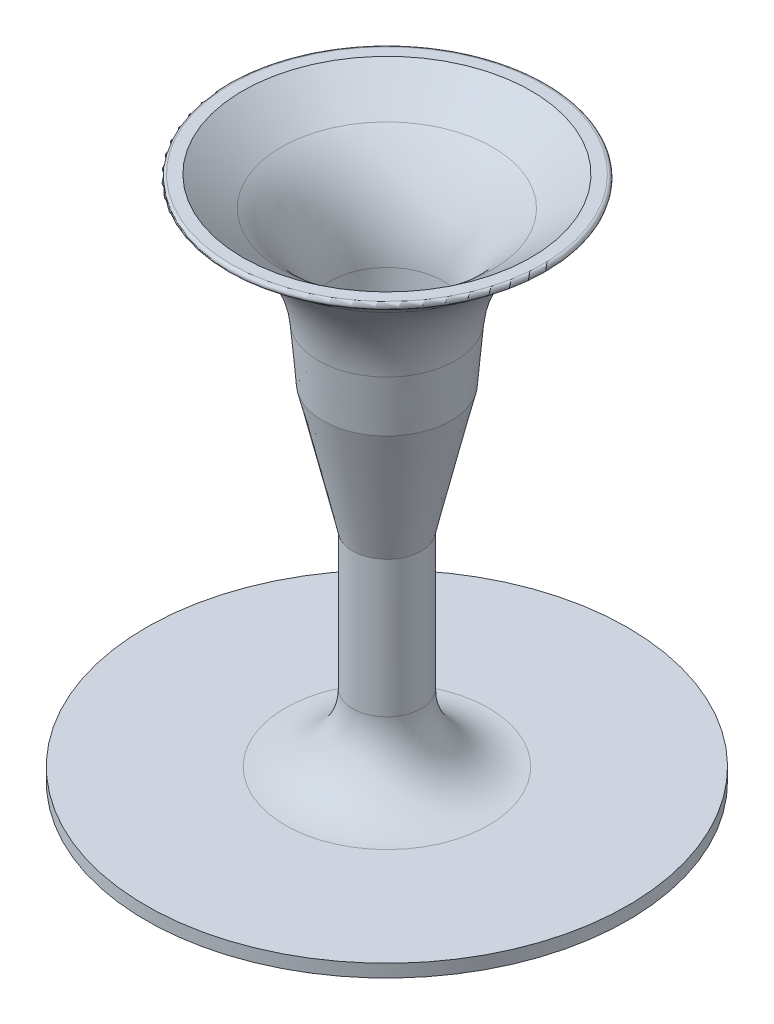
ISO-10303-21;
HEADER;
FILE_DESCRIPTION(('STEP AP214'),'2;1');
FILE_NAME('part.step','',(''),(''),'','','');
FILE_SCHEMA(('AUTOMOTIVE_DESIGN { 1 0 10303 214 1 1 1 1 }'));
ENDSEC;
DATA;
#1=APPLICATION_CONTEXT('core data for automotive mechanical design processes');
#2=APPLICATION_PROTOCOL_DEFINITION('international standard','automotive_design',2000,#1);
#3=PRODUCT_CONTEXT('',#1,'mechanical');
#4=PRODUCT('Part','Part','',(#3));
#5=PRODUCT_RELATED_PRODUCT_CATEGORY('part','',(#4));
#6=PRODUCT_DEFINITION_FORMATION('','',#4);
#7=PRODUCT_DEFINITION_CONTEXT('part definition',#1,'design');
#8=PRODUCT_DEFINITION('design','',#6,#7);
#9=PRODUCT_DEFINITION_SHAPE('','',#8);
#10=(LENGTH_UNIT() NAMED_UNIT(*) SI_UNIT(.MILLI.,.METRE.));
#11=(NAMED_UNIT(*) PLANE_ANGLE_UNIT() SI_UNIT($,.RADIAN.));
#12=(NAMED_UNIT(*) SI_UNIT($,.STERADIAN.) SOLID_ANGLE_UNIT());
#13=UNCERTAINTY_MEASURE_WITH_UNIT(LENGTH_MEASURE(1.E-05),#10,'distance_accuracy_value','');
#14=(GEOMETRIC_REPRESENTATION_CONTEXT(3) GLOBAL_UNCERTAINTY_ASSIGNED_CONTEXT((#13)) GLOBAL_UNIT_ASSIGNED_CONTEXT((#10,
#11,#12)) REPRESENTATION_CONTEXT('',''));
#15=CARTESIAN_POINT('',(0.,0.,0.));
#16=DIRECTION('',(0.,0.,1.));
#17=DIRECTION('',(1.,0.,0.));
#18=AXIS2_PLACEMENT_3D('',#15,#16,#17);
#19=CARTESIAN_POINT('',(0.,-50.,0.));
#20=DIRECTION('',(0.,1.,0.));
#21=DIRECTION('',(0.,0.,1.));
#22=AXIS2_PLACEMENT_3D('',#19,#20,#21);
#23=PLANE('',#22);
#24=CARTESIAN_POINT('',(0.,-50.,0.));
#25=DIRECTION('',(0.,1.,0.));
#26=DIRECTION('',(0.,0.,1.));
#27=AXIS2_PLACEMENT_3D('',#24,#25,#26);
#28=CIRCLE('',#27,3.34999999999998);
#29=CARTESIAN_POINT('',(0.,-50.,3.34999999999998));
#30=VERTEX_POINT('',#29);
#31=EDGE_CURVE('E57',#30,#30,#28,.T.);
#32=ORIENTED_EDGE('',*,*,#31,.T.);
#33=EDGE_LOOP('',(#32));
#34=FACE_BOUND('',#33,.T.);
#35=ADVANCED_FACE('F37',(#34),#23,.T.);
#36=CARTESIAN_POINT('',(0.,74.3904688799529,0.));
#37=DIRECTION('',(0.,1.,0.));
#38=DIRECTION('',(0.,0.,1.));
#39=AXIS2_PLACEMENT_3D('',#36,#37,#38);
#40=CYLINDRICAL_SURFACE('',#39,3.34999999999998);
#41=CARTESIAN_POINT('',(0.,-20.,0.));
#42=DIRECTION('',(0.,1.,0.));
#43=DIRECTION('',(0.,0.,1.));
#44=AXIS2_PLACEMENT_3D('',#41,#42,#43);
#45=CIRCLE('',#44,3.34999999999998);
#46=CARTESIAN_POINT('',(0.,-20.,3.34999999999998));
#47=VERTEX_POINT('',#46);
#48=EDGE_CURVE('E60',#47,#47,#45,.T.);
#49=ORIENTED_EDGE('',*,*,#48,.T.);
#50=EDGE_LOOP('',(#49));
#51=FACE_BOUND('',#50,.T.);
#52=ORIENTED_EDGE('',*,*,#31,.F.);
#53=EDGE_LOOP('',(#52));
#54=FACE_BOUND('',#53,.T.);
#55=ADVANCED_FACE('F113',(#51,#54),#40,.F.);
#56=CARTESIAN_POINT('',(0.,-20.,0.));
#57=DIRECTION('',(0.,1.,0.));
#58=DIRECTION('',(0.,0.,1.));
#59=AXIS2_PLACEMENT_3D('',#56,#57,#58);
#60=CONICAL_SURFACE('',#59,3.34999999999998,0.228441482093904);
#61=CARTESIAN_POINT('',(0.,0.,0.));
#62=DIRECTION('',(0.,1.,0.));
#63=DIRECTION('',(0.,0.,1.));
#64=AXIS2_PLACEMENT_3D('',#61,#62,#63);
#65=CIRCLE('',#64,8.);
#66=CARTESIAN_POINT('',(0.,0.,8.));
#67=VERTEX_POINT('',#66);
#68=EDGE_CURVE('E63',#67,#67,#65,.T.);
#69=ORIENTED_EDGE('',*,*,#68,.T.);
#70=EDGE_LOOP('',(#69));
#71=FACE_BOUND('',#70,.T.);
#72=ORIENTED_EDGE('',*,*,#48,.F.);
#73=EDGE_LOOP('',(#72));
#74=FACE_BOUND('',#73,.T.);
#75=ADVANCED_FACE('F119',(#71,#74),#60,.F.);
#76=CARTESIAN_POINT('',(0.,0.,0.));
#77=DIRECTION('',(0.,1.,0.));
#78=DIRECTION('',(0.,0.,1.));
#79=AXIS2_PLACEMENT_3D('',#76,#77,#78);
#80=CONICAL_SURFACE('',#79,8.,0.0831412318884402);
#81=CARTESIAN_POINT('',(0.,9.19533592387511,0.));
#82=DIRECTION('',(0.,1.,0.));
#83=DIRECTION('',(0.,0.,1.));
#84=AXIS2_PLACEMENT_3D('',#81,#82,#83);
#85=CIRCLE('',#84,8.76627799365625);
#86=CARTESIAN_POINT('',(0.,9.19533592387511,8.76627799365625));
#87=VERTEX_POINT('',#86);
#88=EDGE_CURVE('E66',#87,#87,#85,.T.);
#89=ORIENTED_EDGE('',*,*,#88,.T.);
#90=EDGE_LOOP('',(#89));
#91=FACE_BOUND('',#90,.T.);
#92=ORIENTED_EDGE('',*,*,#68,.F.);
#93=EDGE_LOOP('',(#92));
#94=FACE_BOUND('',#93,.T.);
#95=ADVANCED_FACE('F151',(#91,#94),#80,.F.);
#96=CARTESIAN_POINT('',(0.,7.53442632680031,0.));
#97=DIRECTION('',(0.,1.,0.));
#98=DIRECTION('',(0.,0.,1.));
#99=AXIS2_PLACEMENT_3D('',#96,#97,#98);
#100=TOROIDAL_SURFACE('',#99,28.6971931585538,20.);
#101=CARTESIAN_POINT('',(0.,23.3869061088923,0.));
#102=DIRECTION('',(0.,1.,0.));
#103=DIRECTION('',(0.,0.,1.));
#104=AXIS2_PLACEMENT_3D('',#101,#102,#103);
#105=CIRCLE('',#104,16.50297794156);
#106=CARTESIAN_POINT('',(0.,23.3869061088923,16.50297794156));
#107=VERTEX_POINT('',#106);
#108=EDGE_CURVE('E69',#107,#107,#105,.T.);
#109=ORIENTED_EDGE('',*,*,#108,.T.);
#110=EDGE_LOOP('',(#109));
#111=FACE_BOUND('',#110,.T.);
#112=ORIENTED_EDGE('',*,*,#88,.F.);
#113=EDGE_LOOP('',(#112));
#114=FACE_BOUND('',#113,.T.);
#115=ADVANCED_FACE('F145',(#111,#114),#100,.T.);
#116=CARTESIAN_POINT('',(0.,23.3869061088923,0.));
#117=DIRECTION('',(0.,1.,0.));
#118=DIRECTION('',(0.,0.,1.));
#119=AXIS2_PLACEMENT_3D('',#116,#117,#118);
#120=CONICAL_SURFACE('',#119,16.50297794156,0.915100700553362);
#121=CARTESIAN_POINT('',(0.,28.,0.));
#122=DIRECTION('',(0.,1.,0.));
#123=DIRECTION('',(0.,0.,1.));
#124=AXIS2_PLACEMENT_3D('',#121,#122,#123);
#125=CIRCLE('',#124,22.5);
#126=CARTESIAN_POINT('',(0.,28.,22.5));
#127=VERTEX_POINT('',#126);
#128=EDGE_CURVE('E72',#127,#127,#125,.T.);
#129=ORIENTED_EDGE('',*,*,#128,.T.);
#130=EDGE_LOOP('',(#129));
#131=FACE_BOUND('',#130,.T.);
#132=ORIENTED_EDGE('',*,*,#108,.F.);
#133=EDGE_LOOP('',(#132));
#134=FACE_BOUND('',#133,.T.);
#135=ADVANCED_FACE('F139',(#131,#134),#120,.F.);
#136=CARTESIAN_POINT('',(-25.7802438933713,28.,0.));
#137=DIRECTION('',(0.,1.,0.));
#138=DIRECTION('',(0.,0.,1.));
#139=AXIS2_PLACEMENT_3D('',#136,#137,#138);
#140=PLANE('',#139);
#141=CARTESIAN_POINT('',(0.,28.,0.));
#142=DIRECTION('',(0.,1.,0.));
#143=DIRECTION('',(0.,0.,1.));
#144=AXIS2_PLACEMENT_3D('',#141,#142,#143);
#145=CIRCLE('',#144,24.3101829200285);
#146=CARTESIAN_POINT('',(0.,28.,24.3101829200285));
#147=VERTEX_POINT('',#146);
#148=EDGE_CURVE('E52',#147,#147,#145,.T.);
#149=ORIENTED_EDGE('',*,*,#148,.T.);
#150=EDGE_LOOP('',(#149));
#151=FACE_BOUND('',#150,.T.);
#152=ORIENTED_EDGE('',*,*,#128,.F.);
#153=EDGE_LOOP('',(#152));
#154=FACE_BOUND('',#153,.T.);
#155=ADVANCED_FACE('F135',(#151,#154),#140,.T.);
#156=CARTESIAN_POINT('',(0.,26.4147520217908,0.));
#157=DIRECTION('',(0.,1.,0.));
#158=DIRECTION('',(0.,0.,1.));
#159=AXIS2_PLACEMENT_3D('',#156,#157,#158);
#160=CONICAL_SURFACE('',#159,23.7194215216994,0.915100700553361);
#161=CARTESIAN_POINT('',(0.,27.1036880054477,0.));
#162=DIRECTION('',(0.,-1.,0.));
#163=DIRECTION('',(0.,0.,-1.));
#164=AXIS2_PLACEMENT_3D('',#161,#162,#163);
#165=CIRCLE('',#164,24.6150383004533);
#166=CARTESIAN_POINT('',(0.,27.1036880054477,-24.6150383004533));
#167=VERTEX_POINT('',#166);
#168=EDGE_CURVE('E48',#167,#167,#165,.T.);
#169=ORIENTED_EDGE('',*,*,#168,.T.);
#170=EDGE_LOOP('',(#169));
#171=FACE_BOUND('',#170,.T.);
#172=CARTESIAN_POINT('',(0.,22.3403487415723,0.));
#173=DIRECTION('',(0.,1.,0.));
#174=DIRECTION('',(0.,0.,1.));
#175=AXIS2_PLACEMENT_3D('',#172,#173,#174);
#176=CIRCLE('',#175,18.4226972574154);
#177=CARTESIAN_POINT('',(0.,22.3403487415723,18.4226972574154));
#178=VERTEX_POINT('',#177);
#179=EDGE_CURVE('E75',#178,#178,#176,.T.);
#180=ORIENTED_EDGE('',*,*,#179,.T.);
#181=EDGE_LOOP('',(#180));
#182=FACE_BOUND('',#181,.T.);
#183=ADVANCED_FACE('F138',(#171,#182),#160,.T.);
#184=CARTESIAN_POINT('',(0.,6.48786895948034,0.));
#185=DIRECTION('',(0.,1.,0.));
#186=DIRECTION('',(0.,0.,1.));
#187=AXIS2_PLACEMENT_3D('',#184,#185,#186);
#188=TOROIDAL_SURFACE('',#187,30.6169124744092,20.);
#189=CARTESIAN_POINT('',(0.,8.14877855655515,0.));
#190=DIRECTION('',(0.,1.,0.));
#191=DIRECTION('',(0.,0.,1.));
#192=AXIS2_PLACEMENT_3D('',#189,#190,#191);
#193=CIRCLE('',#192,10.6859973095116);
#194=CARTESIAN_POINT('',(0.,8.14877855655515,10.6859973095116));
#195=VERTEX_POINT('',#194);
#196=EDGE_CURVE('E78',#195,#195,#193,.T.);
#197=ORIENTED_EDGE('',*,*,#196,.T.);
#198=EDGE_LOOP('',(#197));
#199=FACE_BOUND('',#198,.T.);
#200=ORIENTED_EDGE('',*,*,#179,.F.);
#201=EDGE_LOOP('',(#200));
#202=FACE_BOUND('',#201,.T.);
#203=ADVANCED_FACE('F170',(#199,#202),#188,.F.);
#204=CARTESIAN_POINT('',(0.,8.14877855655515,0.));
#205=DIRECTION('',(0.,1.,0.));
#206=DIRECTION('',(0.,0.,1.));
#207=AXIS2_PLACEMENT_3D('',#204,#205,#206);
#208=CONICAL_SURFACE('',#207,10.6859973095116,0.083141231888441);
#209=CARTESIAN_POINT('',(0.,-0.311144597230181,0.));
#210=DIRECTION('',(0.,1.,0.));
#211=DIRECTION('',(0.,0.,1.));
#212=AXIS2_PLACEMENT_3D('',#209,#210,#211);
#213=CIRCLE('',#212,9.98100371336286);
#214=CARTESIAN_POINT('',(0.,-0.311144597230181,9.98100371336286));
#215=VERTEX_POINT('',#214);
#216=EDGE_CURVE('E81',#215,#215,#213,.T.);
#217=ORIENTED_EDGE('',*,*,#216,.T.);
#218=EDGE_LOOP('',(#217));
#219=FACE_BOUND('',#218,.T.);
#220=ORIENTED_EDGE('',*,*,#196,.F.);
#221=EDGE_LOOP('',(#220));
#222=FACE_BOUND('',#221,.T.);
#223=ADVANCED_FACE('F174',(#219,#222),#208,.T.);
#224=CARTESIAN_POINT('',(0.,-0.311144597230181,0.));
#225=DIRECTION('',(0.,1.,0.));
#226=DIRECTION('',(0.,0.,1.));
#227=AXIS2_PLACEMENT_3D('',#224,#225,#226);
#228=CONICAL_SURFACE('',#227,9.98100371336286,0.228441482093904);
#229=CARTESIAN_POINT('',(0.,-20.2294401385758,0.));
#230=DIRECTION('',(0.,1.,0.));
#231=DIRECTION('',(0.,0.,1.));
#232=AXIS2_PLACEMENT_3D('',#229,#230,#231);
#233=CIRCLE('',#232,5.34999999999999);
#234=CARTESIAN_POINT('',(0.,-20.2294401385758,5.34999999999999));
#235=VERTEX_POINT('',#234);
#236=EDGE_CURVE('E84',#235,#235,#233,.T.);
#237=ORIENTED_EDGE('',*,*,#236,.T.);
#238=EDGE_LOOP('',(#237));
#239=FACE_BOUND('',#238,.T.);
#240=ORIENTED_EDGE('',*,*,#216,.F.);
#241=EDGE_LOOP('',(#240));
#242=FACE_BOUND('',#241,.T.);
#243=ADVANCED_FACE('F129',(#239,#242),#228,.T.);
#244=CARTESIAN_POINT('',(0.,74.3904688799529,0.));
#245=DIRECTION('',(0.,1.,0.));
#246=DIRECTION('',(0.,0.,1.));
#247=AXIS2_PLACEMENT_3D('',#244,#245,#246);
#248=CYLINDRICAL_SURFACE('',#247,5.34999999999999);
#249=CARTESIAN_POINT('',(0.,-41.5,0.));
#250=DIRECTION('',(0.,-1.,0.));
#251=DIRECTION('',(0.,0.,-1.));
#252=AXIS2_PLACEMENT_3D('',#249,#250,#251);
#253=CIRCLE('',#252,5.34999999999999);
#254=CARTESIAN_POINT('',(0.,-41.5,-5.34999999999999));
#255=VERTEX_POINT('',#254);
#256=EDGE_CURVE('E44',#255,#255,#253,.F.);
#257=ORIENTED_EDGE('',*,*,#256,.T.);
#258=EDGE_LOOP('',(#257));
#259=FACE_BOUND('',#258,.T.);
#260=ORIENTED_EDGE('',*,*,#236,.F.);
#261=EDGE_LOOP('',(#260));
#262=FACE_BOUND('',#261,.T.);
#263=ADVANCED_FACE('F124',(#259,#262),#248,.T.);
#264=CARTESIAN_POINT('',(0.,27.5,0.));
#265=DIRECTION('',(0.,1.,0.));
#266=DIRECTION('',(0.,0.,1.));
#267=AXIS2_PLACEMENT_3D('',#264,#265,#266);
#268=TOROIDAL_SURFACE('',#267,24.3101829200285,0.5);
#269=ORIENTED_EDGE('',*,*,#168,.F.);
#270=EDGE_LOOP('',(#269));
#271=FACE_BOUND('',#270,.T.);
#272=ORIENTED_EDGE('',*,*,#148,.F.);
#273=EDGE_LOOP('',(#272));
#274=FACE_BOUND('',#273,.T.);
#275=ADVANCED_FACE('F99',(#271,#274),#268,.T.);
#276=CARTESIAN_POINT('',(0.,-54.,0.));
#277=DIRECTION('',(0.,1.,0.));
#278=DIRECTION('',(0.,0.,1.));
#279=AXIS2_PLACEMENT_3D('',#276,#277,#278);
#280=CYLINDRICAL_SURFACE('',#279,37.5547051313074);
#281=CARTESIAN_POINT('',(0.,-54.,0.));
#282=DIRECTION('',(0.,-1.,0.));
#283=DIRECTION('',(0.,0.,-1.));
#284=AXIS2_PLACEMENT_3D('',#281,#282,#283);
#285=CIRCLE('',#284,37.5547051313074);
#286=CARTESIAN_POINT('',(0.,-54.,-37.5547051313074));
#287=VERTEX_POINT('',#286);
#288=EDGE_CURVE('E87',#287,#287,#285,.T.);
#289=ORIENTED_EDGE('',*,*,#288,.F.);
#290=EDGE_LOOP('',(#289));
#291=FACE_BOUND('',#290,.T.);
#292=CARTESIAN_POINT('',(0.,-52.,0.));
#293=DIRECTION('',(0.,-1.,0.));
#294=DIRECTION('',(0.,0.,-1.));
#295=AXIS2_PLACEMENT_3D('',#292,#293,#294);
#296=CIRCLE('',#295,37.5547051313074);
#297=CARTESIAN_POINT('',(0.,-52.,-37.5547051313074));
#298=VERTEX_POINT('',#297);
#299=EDGE_CURVE('E88',#298,#298,#296,.T.);
#300=ORIENTED_EDGE('',*,*,#299,.T.);
#301=EDGE_LOOP('',(#300));
#302=FACE_BOUND('',#301,.T.);
#303=ADVANCED_FACE('F96',(#291,#302),#280,.T.);
#304=CARTESIAN_POINT('',(0.,-54.,0.));
#305=DIRECTION('',(0.,-1.,0.));
#306=DIRECTION('',(0.,0.,-1.));
#307=AXIS2_PLACEMENT_3D('',#304,#305,#306);
#308=PLANE('',#307);
#309=ORIENTED_EDGE('',*,*,#288,.T.);
#310=EDGE_LOOP('',(#309));
#311=FACE_BOUND('',#310,.T.);
#312=ADVANCED_FACE('F94',(#311),#308,.T.);
#313=CARTESIAN_POINT('',(0.,-52.,0.));
#314=DIRECTION('',(0.,-1.,0.));
#315=DIRECTION('',(0.,0.,-1.));
#316=AXIS2_PLACEMENT_3D('',#313,#314,#315);
#317=PLANE('',#316);
#318=CARTESIAN_POINT('',(0.,-52.,0.));
#319=DIRECTION('',(0.,-1.,0.));
#320=DIRECTION('',(0.,0.,-1.));
#321=AXIS2_PLACEMENT_3D('',#318,#319,#320);
#322=CIRCLE('',#321,15.85);
#323=CARTESIAN_POINT('',(0.,-52.,-15.85));
#324=VERTEX_POINT('',#323);
#325=EDGE_CURVE('E10',#324,#324,#322,.T.);
#326=ORIENTED_EDGE('',*,*,#325,.T.);
#327=EDGE_LOOP('',(#326));
#328=FACE_BOUND('',#327,.T.);
#329=ORIENTED_EDGE('',*,*,#299,.F.);
#330=EDGE_LOOP('',(#329));
#331=FACE_BOUND('',#330,.T.);
#332=ADVANCED_FACE('F103',(#328,#331),#317,.F.);
#333=CARTESIAN_POINT('',(0.,-41.5,0.));
#334=DIRECTION('',(0.,-1.,0.));
#335=DIRECTION('',(0.,0.,-1.));
#336=AXIS2_PLACEMENT_3D('',#333,#334,#335);
#337=TOROIDAL_SURFACE('',#336,15.85,10.5);
#338=ORIENTED_EDGE('',*,*,#325,.F.);
#339=EDGE_LOOP('',(#338));
#340=FACE_BOUND('',#339,.T.);
#341=ORIENTED_EDGE('',*,*,#256,.F.);
#342=EDGE_LOOP('',(#341));
#343=FACE_BOUND('',#342,.T.);
#344=ADVANCED_FACE('F39',(#340,#343),#337,.F.);
#345=CLOSED_SHELL('',(#35,#55,#75,#95,#115,#135,#155,#183,#203,#223,#243,#263,#275,#303,#312,
#332,#344));
#346=MANIFOLD_SOLID_BREP('B2',#345);
#347=ADVANCED_BREP_SHAPE_REPRESENTATION('',(#18,#346),#14);
#348=SHAPE_DEFINITION_REPRESENTATION(#9,#347);
ENDSEC;
END-ISO-10303-21;
